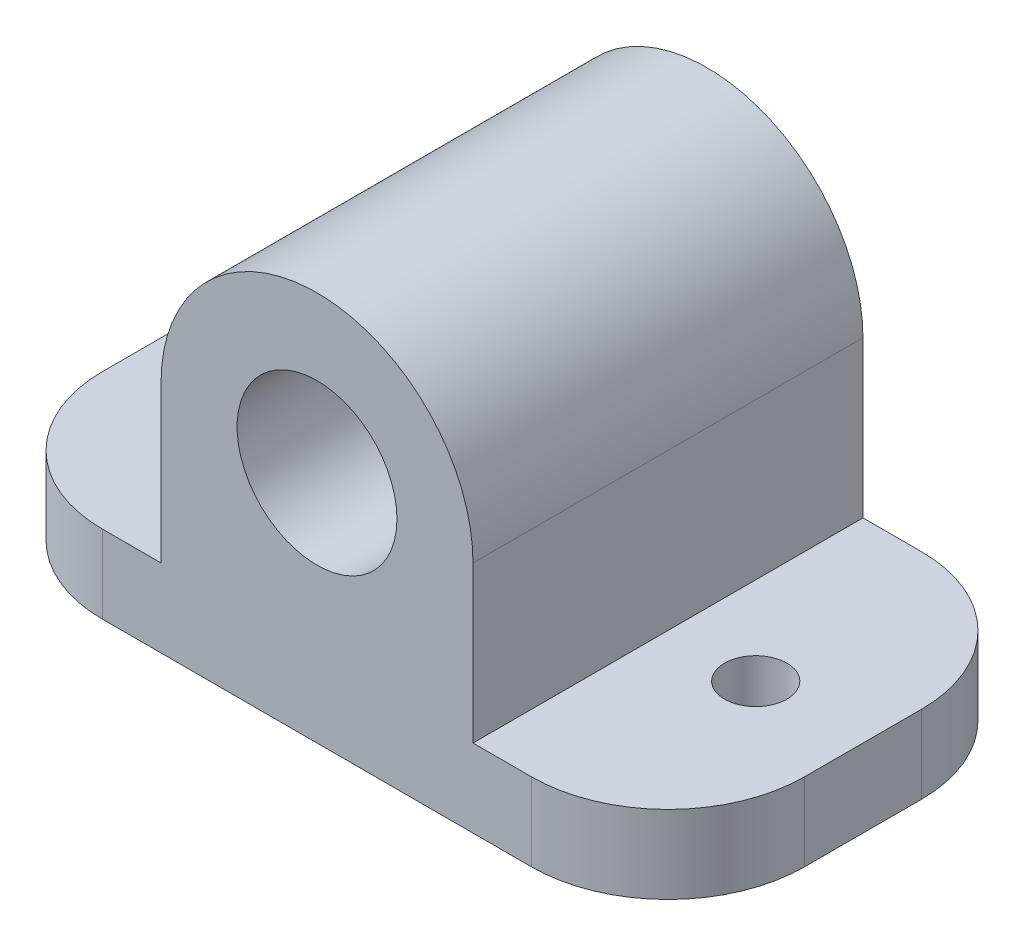
ISO-10303-21;
HEADER;
FILE_DESCRIPTION(('STEP AP214'),'2;1');
FILE_NAME('part.step','',(''),(''),'','','');
FILE_SCHEMA(('AUTOMOTIVE_DESIGN { 1 0 10303 214 1 1 1 1 }'));
ENDSEC;
DATA;
#1=APPLICATION_CONTEXT('core data for automotive mechanical design processes');
#2=APPLICATION_PROTOCOL_DEFINITION('international standard','automotive_design',2000,#1);
#3=PRODUCT_CONTEXT('',#1,'mechanical');
#4=PRODUCT('Part','Part','',(#3));
#5=PRODUCT_RELATED_PRODUCT_CATEGORY('part','',(#4));
#6=PRODUCT_DEFINITION_FORMATION('','',#4);
#7=PRODUCT_DEFINITION_CONTEXT('part definition',#1,'design');
#8=PRODUCT_DEFINITION('design','',#6,#7);
#9=PRODUCT_DEFINITION_SHAPE('','',#8);
#10=(LENGTH_UNIT() NAMED_UNIT(*) SI_UNIT(.MILLI.,.METRE.));
#11=(NAMED_UNIT(*) PLANE_ANGLE_UNIT() SI_UNIT($,.RADIAN.));
#12=(NAMED_UNIT(*) SI_UNIT($,.STERADIAN.) SOLID_ANGLE_UNIT());
#13=UNCERTAINTY_MEASURE_WITH_UNIT(LENGTH_MEASURE(1.E-05),#10,'distance_accuracy_value','');
#14=(GEOMETRIC_REPRESENTATION_CONTEXT(3) GLOBAL_UNCERTAINTY_ASSIGNED_CONTEXT((#13)) GLOBAL_UNIT_ASSIGNED_CONTEXT((#10,
#11,#12)) REPRESENTATION_CONTEXT('',''));
#15=CARTESIAN_POINT('',(0.,0.,0.));
#16=DIRECTION('',(0.,0.,1.));
#17=DIRECTION('',(1.,0.,0.));
#18=AXIS2_PLACEMENT_3D('',#15,#16,#17);
#19=CARTESIAN_POINT('',(0.,0.,20.));
#20=DIRECTION('',(0.,0.,1.));
#21=DIRECTION('',(1.,0.,0.));
#22=AXIS2_PLACEMENT_3D('',#19,#20,#21);
#23=PLANE('',#22);
#24=DIRECTION('',(-1.,0.,0.));
#25=VECTOR('',#24,1.);
#26=CARTESIAN_POINT('',(-8.,-8.,20.));
#27=LINE('',#26,#25);
#28=CARTESIAN_POINT('',(-8.,-8.,20.));
#29=VERTEX_POINT('',#28);
#30=CARTESIAN_POINT('',(-11.,-8.,20.));
#31=VERTEX_POINT('',#30);
#32=EDGE_CURVE('E134',#29,#31,#27,.T.);
#33=ORIENTED_EDGE('',*,*,#32,.T.);
#34=DIRECTION('',(0.,-1.,0.));
#35=VECTOR('',#34,1.);
#36=CARTESIAN_POINT('',(-11.,-12.,20.));
#37=LINE('',#36,#35);
#38=CARTESIAN_POINT('',(-11.,-12.,20.));
#39=VERTEX_POINT('',#38);
#40=EDGE_CURVE('E183',#31,#39,#37,.T.);
#41=ORIENTED_EDGE('',*,*,#40,.T.);
#42=DIRECTION('',(1.,0.,0.));
#43=VECTOR('',#42,1.);
#44=CARTESIAN_POINT('',(-18.,-12.,20.));
#45=LINE('',#44,#43);
#46=CARTESIAN_POINT('',(11.,-12.,20.));
#47=VERTEX_POINT('',#46);
#48=EDGE_CURVE('E240',#39,#47,#45,.T.);
#49=ORIENTED_EDGE('',*,*,#48,.T.);
#50=DIRECTION('',(0.,1.,0.));
#51=VECTOR('',#50,1.);
#52=CARTESIAN_POINT('',(11.,-8.,20.));
#53=LINE('',#52,#51);
#54=CARTESIAN_POINT('',(11.,-8.,20.));
#55=VERTEX_POINT('',#54);
#56=EDGE_CURVE('E180',#47,#55,#53,.T.);
#57=ORIENTED_EDGE('',*,*,#56,.T.);
#58=DIRECTION('',(-1.,0.,0.));
#59=VECTOR('',#58,1.);
#60=CARTESIAN_POINT('',(8.,-8.,20.));
#61=LINE('',#60,#59);
#62=CARTESIAN_POINT('',(8.,-8.,20.));
#63=VERTEX_POINT('',#62);
#64=EDGE_CURVE('E238',#55,#63,#61,.T.);
#65=ORIENTED_EDGE('',*,*,#64,.T.);
#66=DIRECTION('',(0.,1.,0.));
#67=VECTOR('',#66,1.);
#68=CARTESIAN_POINT('',(8.,0.,20.));
#69=LINE('',#68,#67);
#70=CARTESIAN_POINT('',(8.,0.,20.));
#71=VERTEX_POINT('',#70);
#72=EDGE_CURVE('E140',#63,#71,#69,.T.);
#73=ORIENTED_EDGE('',*,*,#72,.T.);
#74=CARTESIAN_POINT('',(0.,0.,20.));
#75=DIRECTION('',(0.,0.,1.));
#76=DIRECTION('',(1.,0.,0.));
#77=AXIS2_PLACEMENT_3D('',#74,#75,#76);
#78=CIRCLE('',#77,8.);
#79=CARTESIAN_POINT('',(-8.,0.,20.));
#80=VERTEX_POINT('',#79);
#81=EDGE_CURVE('E135',#71,#80,#78,.T.);
#82=ORIENTED_EDGE('',*,*,#81,.T.);
#83=DIRECTION('',(0.,-1.,0.));
#84=VECTOR('',#83,1.);
#85=CARTESIAN_POINT('',(-8.,0.,20.));
#86=LINE('',#85,#84);
#87=EDGE_CURVE('E123',#80,#29,#86,.T.);
#88=ORIENTED_EDGE('',*,*,#87,.T.);
#89=EDGE_LOOP('',(#33,#41,#49,#57,#65,#73,#82,#88));
#90=FACE_BOUND('',#89,.T.);
#91=CARTESIAN_POINT('',(0.,0.,20.));
#92=DIRECTION('',(0.,0.,1.));
#93=DIRECTION('',(1.,0.,0.));
#94=AXIS2_PLACEMENT_3D('',#91,#92,#93);
#95=CIRCLE('',#94,4.1);
#96=CARTESIAN_POINT('',(4.1,0.,20.));
#97=VERTEX_POINT('',#96);
#98=EDGE_CURVE('E244',#97,#97,#95,.T.);
#99=ORIENTED_EDGE('',*,*,#98,.F.);
#100=EDGE_LOOP('',(#99));
#101=FACE_BOUND('',#100,.T.);
#102=ADVANCED_FACE('F33',(#90,#101),#23,.T.);
#103=CARTESIAN_POINT('',(0.,0.,0.));
#104=DIRECTION('',(0.,0.,1.));
#105=DIRECTION('',(1.,0.,0.));
#106=AXIS2_PLACEMENT_3D('',#103,#104,#105);
#107=PLANE('',#106);
#108=DIRECTION('',(1.,0.,0.));
#109=VECTOR('',#108,1.);
#110=CARTESIAN_POINT('',(-18.,-12.,0.));
#111=LINE('',#110,#109);
#112=CARTESIAN_POINT('',(-11.,-12.,0.));
#113=VERTEX_POINT('',#112);
#114=CARTESIAN_POINT('',(11.,-12.,0.));
#115=VERTEX_POINT('',#114);
#116=EDGE_CURVE('E224',#113,#115,#111,.T.);
#117=ORIENTED_EDGE('',*,*,#116,.F.);
#118=DIRECTION('',(0.,-1.,0.));
#119=VECTOR('',#118,1.);
#120=CARTESIAN_POINT('',(-11.,0.,0.));
#121=LINE('',#120,#119);
#122=CARTESIAN_POINT('',(-11.,-8.,0.));
#123=VERTEX_POINT('',#122);
#124=EDGE_CURVE('E174',#113,#123,#121,.F.);
#125=ORIENTED_EDGE('',*,*,#124,.T.);
#126=DIRECTION('',(-1.,0.,0.));
#127=VECTOR('',#126,1.);
#128=CARTESIAN_POINT('',(-8.,-8.,0.));
#129=LINE('',#128,#127);
#130=CARTESIAN_POINT('',(-8.,-8.,0.));
#131=VERTEX_POINT('',#130);
#132=EDGE_CURVE('E231',#131,#123,#129,.T.);
#133=ORIENTED_EDGE('',*,*,#132,.F.);
#134=DIRECTION('',(0.,-1.,0.));
#135=VECTOR('',#134,1.);
#136=CARTESIAN_POINT('',(-8.,0.,0.));
#137=LINE('',#136,#135);
#138=CARTESIAN_POINT('',(-8.,0.,0.));
#139=VERTEX_POINT('',#138);
#140=EDGE_CURVE('E234',#139,#131,#137,.T.);
#141=ORIENTED_EDGE('',*,*,#140,.F.);
#142=CARTESIAN_POINT('',(0.,0.,0.));
#143=DIRECTION('',(0.,0.,1.));
#144=DIRECTION('',(1.,0.,0.));
#145=AXIS2_PLACEMENT_3D('',#142,#143,#144);
#146=CIRCLE('',#145,8.);
#147=CARTESIAN_POINT('',(8.,0.,0.));
#148=VERTEX_POINT('',#147);
#149=EDGE_CURVE('E148',#148,#139,#146,.T.);
#150=ORIENTED_EDGE('',*,*,#149,.F.);
#151=DIRECTION('',(0.,1.,0.));
#152=VECTOR('',#151,1.);
#153=CARTESIAN_POINT('',(8.,0.,0.));
#154=LINE('',#153,#152);
#155=CARTESIAN_POINT('',(8.,-8.,0.));
#156=VERTEX_POINT('',#155);
#157=EDGE_CURVE('E144',#156,#148,#154,.T.);
#158=ORIENTED_EDGE('',*,*,#157,.F.);
#159=DIRECTION('',(-1.,0.,0.));
#160=VECTOR('',#159,1.);
#161=CARTESIAN_POINT('',(8.,-8.,0.));
#162=LINE('',#161,#160);
#163=CARTESIAN_POINT('',(11.,-8.,0.));
#164=VERTEX_POINT('',#163);
#165=EDGE_CURVE('E230',#164,#156,#162,.T.);
#166=ORIENTED_EDGE('',*,*,#165,.F.);
#167=DIRECTION('',(0.,1.,0.));
#168=VECTOR('',#167,1.);
#169=CARTESIAN_POINT('',(11.,0.,0.));
#170=LINE('',#169,#168);
#171=EDGE_CURVE('E172',#164,#115,#170,.F.);
#172=ORIENTED_EDGE('',*,*,#171,.T.);
#173=EDGE_LOOP('',(#117,#125,#133,#141,#150,#158,#166,#172));
#174=FACE_BOUND('',#173,.T.);
#175=CARTESIAN_POINT('',(0.,0.,0.));
#176=DIRECTION('',(0.,0.,1.));
#177=DIRECTION('',(1.,0.,0.));
#178=AXIS2_PLACEMENT_3D('',#175,#176,#177);
#179=CIRCLE('',#178,4.1);
#180=CARTESIAN_POINT('',(4.1,0.,0.));
#181=VERTEX_POINT('',#180);
#182=EDGE_CURVE('E159',#181,#181,#179,.T.);
#183=ORIENTED_EDGE('',*,*,#182,.T.);
#184=EDGE_LOOP('',(#183));
#185=FACE_BOUND('',#184,.T.);
#186=ADVANCED_FACE('F226',(#174,#185),#107,.F.);
#187=CARTESIAN_POINT('',(0.,0.,20.));
#188=DIRECTION('',(0.,0.,-1.));
#189=DIRECTION('',(-1.,0.,0.));
#190=AXIS2_PLACEMENT_3D('',#187,#188,#189);
#191=CYLINDRICAL_SURFACE('',#190,8.);
#192=ORIENTED_EDGE('',*,*,#149,.T.);
#193=DIRECTION('',(0.,0.,-1.));
#194=VECTOR('',#193,1.);
#195=CARTESIAN_POINT('',(-8.,0.,20.));
#196=LINE('',#195,#194);
#197=EDGE_CURVE('E127',#80,#139,#196,.T.);
#198=ORIENTED_EDGE('',*,*,#197,.F.);
#199=ORIENTED_EDGE('',*,*,#81,.F.);
#200=DIRECTION('',(0.,0.,-1.));
#201=VECTOR('',#200,1.);
#202=CARTESIAN_POINT('',(8.,0.,20.));
#203=LINE('',#202,#201);
#204=EDGE_CURVE('E202',#71,#148,#203,.T.);
#205=ORIENTED_EDGE('',*,*,#204,.T.);
#206=EDGE_LOOP('',(#192,#198,#199,#205));
#207=FACE_BOUND('',#206,.T.);
#208=ADVANCED_FACE('F146',(#207),#191,.T.);
#209=CARTESIAN_POINT('',(-8.,0.,20.));
#210=DIRECTION('',(1.,0.,0.));
#211=DIRECTION('',(0.,1.,0.));
#212=AXIS2_PLACEMENT_3D('',#209,#210,#211);
#213=PLANE('',#212);
#214=ORIENTED_EDGE('',*,*,#140,.T.);
#215=DIRECTION('',(0.,0.,-1.));
#216=VECTOR('',#215,1.);
#217=CARTESIAN_POINT('',(-8.,-8.,20.));
#218=LINE('',#217,#216);
#219=EDGE_CURVE('E130',#29,#131,#218,.T.);
#220=ORIENTED_EDGE('',*,*,#219,.F.);
#221=ORIENTED_EDGE('',*,*,#87,.F.);
#222=ORIENTED_EDGE('',*,*,#197,.T.);
#223=EDGE_LOOP('',(#214,#220,#221,#222));
#224=FACE_BOUND('',#223,.T.);
#225=ADVANCED_FACE('F125',(#224),#213,.F.);
#226=CARTESIAN_POINT('',(-8.,-8.,20.));
#227=DIRECTION('',(0.,-1.,0.));
#228=DIRECTION('',(1.,0.,0.));
#229=AXIS2_PLACEMENT_3D('',#226,#227,#228);
#230=PLANE('',#229);
#231=CARTESIAN_POINT('',(-12.5,-8.,10.));
#232=DIRECTION('',(0.,1.,0.));
#233=DIRECTION('',(-1.,0.,0.));
#234=AXIS2_PLACEMENT_3D('',#231,#232,#233);
#235=CIRCLE('',#234,1.6);
#236=CARTESIAN_POINT('',(-14.1,-8.,10.));
#237=VERTEX_POINT('',#236);
#238=EDGE_CURVE('E160',#237,#237,#235,.T.);
#239=ORIENTED_EDGE('',*,*,#238,.F.);
#240=EDGE_LOOP('',(#239));
#241=FACE_BOUND('',#240,.T.);
#242=ORIENTED_EDGE('',*,*,#132,.T.);
#243=CARTESIAN_POINT('',(-11.,-8.,7.));
#244=DIRECTION('',(0.,-1.,0.));
#245=DIRECTION('',(1.,0.,0.));
#246=AXIS2_PLACEMENT_3D('',#243,#244,#245);
#247=CIRCLE('',#246,7.);
#248=CARTESIAN_POINT('',(-18.,-8.,7.));
#249=VERTEX_POINT('',#248);
#250=EDGE_CURVE('E178',#123,#249,#247,.F.);
#251=ORIENTED_EDGE('',*,*,#250,.T.);
#252=DIRECTION('',(0.,0.,-1.));
#253=VECTOR('',#252,1.);
#254=CARTESIAN_POINT('',(-18.,-8.,20.));
#255=LINE('',#254,#253);
#256=CARTESIAN_POINT('',(-18.,-8.,13.));
#257=VERTEX_POINT('',#256);
#258=EDGE_CURVE('E153',#257,#249,#255,.T.);
#259=ORIENTED_EDGE('',*,*,#258,.F.);
#260=CARTESIAN_POINT('',(-11.,-8.,13.));
#261=DIRECTION('',(0.,-1.,0.));
#262=DIRECTION('',(1.,0.,0.));
#263=AXIS2_PLACEMENT_3D('',#260,#261,#262);
#264=CIRCLE('',#263,7.);
#265=EDGE_CURVE('E176',#257,#31,#264,.F.);
#266=ORIENTED_EDGE('',*,*,#265,.T.);
#267=ORIENTED_EDGE('',*,*,#32,.F.);
#268=ORIENTED_EDGE('',*,*,#219,.T.);
#269=EDGE_LOOP('',(#242,#251,#259,#266,#267,#268));
#270=FACE_BOUND('',#269,.T.);
#271=ADVANCED_FACE('F245',(#241,#270),#230,.F.);
#272=CARTESIAN_POINT('',(-18.,-8.,20.));
#273=DIRECTION('',(1.,0.,0.));
#274=DIRECTION('',(0.,0.,-1.));
#275=AXIS2_PLACEMENT_3D('',#272,#273,#274);
#276=PLANE('',#275);
#277=ORIENTED_EDGE('',*,*,#258,.T.);
#278=DIRECTION('',(0.,-1.,0.));
#279=VECTOR('',#278,1.);
#280=CARTESIAN_POINT('',(-18.,-8.,7.));
#281=LINE('',#280,#279);
#282=CARTESIAN_POINT('',(-18.,-12.,7.));
#283=VERTEX_POINT('',#282);
#284=EDGE_CURVE('E151',#249,#283,#281,.T.);
#285=ORIENTED_EDGE('',*,*,#284,.T.);
#286=DIRECTION('',(0.,0.,-1.));
#287=VECTOR('',#286,1.);
#288=CARTESIAN_POINT('',(-18.,-12.,20.));
#289=LINE('',#288,#287);
#290=CARTESIAN_POINT('',(-18.,-12.,13.));
#291=VERTEX_POINT('',#290);
#292=EDGE_CURVE('E199',#291,#283,#289,.T.);
#293=ORIENTED_EDGE('',*,*,#292,.F.);
#294=DIRECTION('',(0.,-1.,0.));
#295=VECTOR('',#294,1.);
#296=CARTESIAN_POINT('',(-18.,-8.,13.));
#297=LINE('',#296,#295);
#298=EDGE_CURVE('E149',#291,#257,#297,.F.);
#299=ORIENTED_EDGE('',*,*,#298,.T.);
#300=EDGE_LOOP('',(#277,#285,#293,#299));
#301=FACE_BOUND('',#300,.T.);
#302=ADVANCED_FACE('F211',(#301),#276,.F.);
#303=CARTESIAN_POINT('',(-18.,-12.,20.));
#304=DIRECTION('',(0.,1.,0.));
#305=DIRECTION('',(-1.,0.,0.));
#306=AXIS2_PLACEMENT_3D('',#303,#304,#305);
#307=PLANE('',#306);
#308=CARTESIAN_POINT('',(12.5,-12.,10.));
#309=DIRECTION('',(0.,1.,0.));
#310=DIRECTION('',(-1.,0.,0.));
#311=AXIS2_PLACEMENT_3D('',#308,#309,#310);
#312=CIRCLE('',#311,1.6);
#313=CARTESIAN_POINT('',(10.9,-12.,10.));
#314=VERTEX_POINT('',#313);
#315=EDGE_CURVE('E256',#314,#314,#312,.T.);
#316=ORIENTED_EDGE('',*,*,#315,.T.);
#317=EDGE_LOOP('',(#316));
#318=FACE_BOUND('',#317,.T.);
#319=CARTESIAN_POINT('',(-12.5,-12.,10.));
#320=DIRECTION('',(0.,1.,0.));
#321=DIRECTION('',(-1.,0.,0.));
#322=AXIS2_PLACEMENT_3D('',#319,#320,#321);
#323=CIRCLE('',#322,1.6);
#324=CARTESIAN_POINT('',(-14.1,-12.,10.));
#325=VERTEX_POINT('',#324);
#326=EDGE_CURVE('E157',#325,#325,#323,.T.);
#327=ORIENTED_EDGE('',*,*,#326,.T.);
#328=EDGE_LOOP('',(#327));
#329=FACE_BOUND('',#328,.T.);
#330=ORIENTED_EDGE('',*,*,#292,.T.);
#331=CARTESIAN_POINT('',(-11.,-12.,7.));
#332=DIRECTION('',(0.,1.,0.));
#333=DIRECTION('',(-1.,0.,0.));
#334=AXIS2_PLACEMENT_3D('',#331,#332,#333);
#335=CIRCLE('',#334,7.);
#336=EDGE_CURVE('E170',#283,#113,#335,.F.);
#337=ORIENTED_EDGE('',*,*,#336,.T.);
#338=ORIENTED_EDGE('',*,*,#116,.T.);
#339=CARTESIAN_POINT('',(11.,-12.,7.));
#340=DIRECTION('',(0.,1.,0.));
#341=DIRECTION('',(-1.,0.,0.));
#342=AXIS2_PLACEMENT_3D('',#339,#340,#341);
#343=CIRCLE('',#342,7.);
#344=CARTESIAN_POINT('',(18.,-12.,7.));
#345=VERTEX_POINT('',#344);
#346=EDGE_CURVE('E164',#115,#345,#343,.F.);
#347=ORIENTED_EDGE('',*,*,#346,.T.);
#348=DIRECTION('',(0.,0.,-1.));
#349=VECTOR('',#348,1.);
#350=CARTESIAN_POINT('',(18.,-12.,20.));
#351=LINE('',#350,#349);
#352=CARTESIAN_POINT('',(18.,-12.,13.));
#353=VERTEX_POINT('',#352);
#354=EDGE_CURVE('E193',#353,#345,#351,.T.);
#355=ORIENTED_EDGE('',*,*,#354,.F.);
#356=CARTESIAN_POINT('',(11.,-12.,13.));
#357=DIRECTION('',(0.,1.,0.));
#358=DIRECTION('',(-1.,0.,0.));
#359=AXIS2_PLACEMENT_3D('',#356,#357,#358);
#360=CIRCLE('',#359,7.);
#361=EDGE_CURVE('E166',#353,#47,#360,.F.);
#362=ORIENTED_EDGE('',*,*,#361,.T.);
#363=ORIENTED_EDGE('',*,*,#48,.F.);
#364=CARTESIAN_POINT('',(-11.,-12.,13.));
#365=DIRECTION('',(0.,1.,0.));
#366=DIRECTION('',(-1.,0.,0.));
#367=AXIS2_PLACEMENT_3D('',#364,#365,#366);
#368=CIRCLE('',#367,7.);
#369=EDGE_CURVE('E168',#39,#291,#368,.F.);
#370=ORIENTED_EDGE('',*,*,#369,.T.);
#371=EDGE_LOOP('',(#330,#337,#338,#347,#355,#362,#363,#370));
#372=FACE_BOUND('',#371,.T.);
#373=ADVANCED_FACE('F223',(#318,#329,#372),#307,.F.);
#374=CARTESIAN_POINT('',(18.,-8.,20.));
#375=DIRECTION('',(-1.,0.,0.));
#376=DIRECTION('',(0.,0.,1.));
#377=AXIS2_PLACEMENT_3D('',#374,#375,#376);
#378=PLANE('',#377);
#379=DIRECTION('',(0.,0.,-1.));
#380=VECTOR('',#379,1.);
#381=CARTESIAN_POINT('',(18.,-8.,20.));
#382=LINE('',#381,#380);
#383=CARTESIAN_POINT('',(18.,-8.,13.));
#384=VERTEX_POINT('',#383);
#385=CARTESIAN_POINT('',(18.,-8.,7.));
#386=VERTEX_POINT('',#385);
#387=EDGE_CURVE('E190',#384,#386,#382,.T.);
#388=ORIENTED_EDGE('',*,*,#387,.F.);
#389=DIRECTION('',(0.,1.,0.));
#390=VECTOR('',#389,1.);
#391=CARTESIAN_POINT('',(18.,-12.,13.));
#392=LINE('',#391,#390);
#393=EDGE_CURVE('E11',#384,#353,#392,.F.);
#394=ORIENTED_EDGE('',*,*,#393,.T.);
#395=ORIENTED_EDGE('',*,*,#354,.T.);
#396=DIRECTION('',(0.,1.,0.));
#397=VECTOR('',#396,1.);
#398=CARTESIAN_POINT('',(18.,-8.,7.));
#399=LINE('',#398,#397);
#400=EDGE_CURVE('E41',#345,#386,#399,.T.);
#401=ORIENTED_EDGE('',*,*,#400,.T.);
#402=EDGE_LOOP('',(#388,#394,#395,#401));
#403=FACE_BOUND('',#402,.T.);
#404=ADVANCED_FACE('F189',(#403),#378,.F.);
#405=CARTESIAN_POINT('',(8.,-8.,20.));
#406=DIRECTION('',(0.,-1.,0.));
#407=DIRECTION('',(1.,0.,0.));
#408=AXIS2_PLACEMENT_3D('',#405,#406,#407);
#409=PLANE('',#408);
#410=CARTESIAN_POINT('',(12.5,-7.99999999999999,10.));
#411=DIRECTION('',(0.,1.,0.));
#412=DIRECTION('',(-1.,0.,0.));
#413=AXIS2_PLACEMENT_3D('',#410,#411,#412);
#414=CIRCLE('',#413,1.6);
#415=CARTESIAN_POINT('',(10.9,-7.99999999999999,10.));
#416=VERTEX_POINT('',#415);
#417=EDGE_CURVE('E259',#416,#416,#414,.T.);
#418=ORIENTED_EDGE('',*,*,#417,.F.);
#419=EDGE_LOOP('',(#418));
#420=FACE_BOUND('',#419,.T.);
#421=ORIENTED_EDGE('',*,*,#64,.F.);
#422=CARTESIAN_POINT('',(11.,-8.,13.));
#423=DIRECTION('',(0.,-1.,0.));
#424=DIRECTION('',(1.,0.,0.));
#425=AXIS2_PLACEMENT_3D('',#422,#423,#424);
#426=CIRCLE('',#425,7.);
#427=EDGE_CURVE('E56',#55,#384,#426,.F.);
#428=ORIENTED_EDGE('',*,*,#427,.T.);
#429=ORIENTED_EDGE('',*,*,#387,.T.);
#430=CARTESIAN_POINT('',(11.,-8.,7.));
#431=DIRECTION('',(0.,-1.,0.));
#432=DIRECTION('',(1.,0.,0.));
#433=AXIS2_PLACEMENT_3D('',#430,#431,#432);
#434=CIRCLE('',#433,7.);
#435=EDGE_CURVE('E48',#386,#164,#434,.F.);
#436=ORIENTED_EDGE('',*,*,#435,.T.);
#437=ORIENTED_EDGE('',*,*,#165,.T.);
#438=DIRECTION('',(0.,0.,-1.));
#439=VECTOR('',#438,1.);
#440=CARTESIAN_POINT('',(8.,-8.,20.));
#441=LINE('',#440,#439);
#442=EDGE_CURVE('E197',#63,#156,#441,.T.);
#443=ORIENTED_EDGE('',*,*,#442,.F.);
#444=EDGE_LOOP('',(#421,#428,#429,#436,#437,#443));
#445=FACE_BOUND('',#444,.T.);
#446=ADVANCED_FACE('F195',(#420,#445),#409,.F.);
#447=CARTESIAN_POINT('',(8.,0.,20.));
#448=DIRECTION('',(-1.,0.,0.));
#449=DIRECTION('',(0.,-1.,0.));
#450=AXIS2_PLACEMENT_3D('',#447,#448,#449);
#451=PLANE('',#450);
#452=ORIENTED_EDGE('',*,*,#157,.T.);
#453=ORIENTED_EDGE('',*,*,#204,.F.);
#454=ORIENTED_EDGE('',*,*,#72,.F.);
#455=ORIENTED_EDGE('',*,*,#442,.T.);
#456=EDGE_LOOP('',(#452,#453,#454,#455));
#457=FACE_BOUND('',#456,.T.);
#458=ADVANCED_FACE('F267',(#457),#451,.F.);
#459=CARTESIAN_POINT('',(0.,0.,20.));
#460=DIRECTION('',(0.,0.,-1.));
#461=DIRECTION('',(-1.,0.,0.));
#462=AXIS2_PLACEMENT_3D('',#459,#460,#461);
#463=CYLINDRICAL_SURFACE('',#462,4.1);
#464=ORIENTED_EDGE('',*,*,#98,.T.);
#465=EDGE_LOOP('',(#464));
#466=FACE_BOUND('',#465,.T.);
#467=ORIENTED_EDGE('',*,*,#182,.F.);
#468=EDGE_LOOP('',(#467));
#469=FACE_BOUND('',#468,.T.);
#470=ADVANCED_FACE('F273',(#466,#469),#463,.F.);
#471=CARTESIAN_POINT('',(-12.5,-28.,10.));
#472=DIRECTION('',(0.,1.,0.));
#473=DIRECTION('',(-1.,0.,0.));
#474=AXIS2_PLACEMENT_3D('',#471,#472,#473);
#475=CYLINDRICAL_SURFACE('',#474,1.6);
#476=ORIENTED_EDGE('',*,*,#238,.T.);
#477=EDGE_LOOP('',(#476));
#478=FACE_BOUND('',#477,.T.);
#479=ORIENTED_EDGE('',*,*,#326,.F.);
#480=EDGE_LOOP('',(#479));
#481=FACE_BOUND('',#480,.T.);
#482=ADVANCED_FACE('F286',(#478,#481),#475,.F.);
#483=CARTESIAN_POINT('',(12.5,-28.,10.));
#484=DIRECTION('',(0.,1.,0.));
#485=DIRECTION('',(-1.,0.,0.));
#486=AXIS2_PLACEMENT_3D('',#483,#484,#485);
#487=CYLINDRICAL_SURFACE('',#486,1.6);
#488=ORIENTED_EDGE('',*,*,#417,.T.);
#489=EDGE_LOOP('',(#488));
#490=FACE_BOUND('',#489,.T.);
#491=ORIENTED_EDGE('',*,*,#315,.F.);
#492=EDGE_LOOP('',(#491));
#493=FACE_BOUND('',#492,.T.);
#494=ADVANCED_FACE('F263',(#490,#493),#487,.F.);
#495=CARTESIAN_POINT('',(-11.,-8.,7.));
#496=DIRECTION('',(0.,-1.,0.));
#497=DIRECTION('',(0.,0.,-1.));
#498=AXIS2_PLACEMENT_3D('',#495,#496,#497);
#499=CYLINDRICAL_SURFACE('',#498,7.);
#500=ORIENTED_EDGE('',*,*,#250,.F.);
#501=ORIENTED_EDGE('',*,*,#124,.F.);
#502=ORIENTED_EDGE('',*,*,#336,.F.);
#503=ORIENTED_EDGE('',*,*,#284,.F.);
#504=EDGE_LOOP('',(#500,#501,#502,#503));
#505=FACE_BOUND('',#504,.T.);
#506=ADVANCED_FACE('F218',(#505),#499,.T.);
#507=CARTESIAN_POINT('',(-11.,0.,13.));
#508=DIRECTION('',(0.,1.,0.));
#509=DIRECTION('',(0.,0.,1.));
#510=AXIS2_PLACEMENT_3D('',#507,#508,#509);
#511=CYLINDRICAL_SURFACE('',#510,7.);
#512=ORIENTED_EDGE('',*,*,#265,.F.);
#513=ORIENTED_EDGE('',*,*,#298,.F.);
#514=ORIENTED_EDGE('',*,*,#369,.F.);
#515=ORIENTED_EDGE('',*,*,#40,.F.);
#516=EDGE_LOOP('',(#512,#513,#514,#515));
#517=FACE_BOUND('',#516,.T.);
#518=ADVANCED_FACE('F295',(#517),#511,.T.);
#519=CARTESIAN_POINT('',(11.,0.,13.));
#520=DIRECTION('',(0.,-1.,0.));
#521=DIRECTION('',(0.,0.,-1.));
#522=AXIS2_PLACEMENT_3D('',#519,#520,#521);
#523=CYLINDRICAL_SURFACE('',#522,7.);
#524=ORIENTED_EDGE('',*,*,#361,.F.);
#525=ORIENTED_EDGE('',*,*,#393,.F.);
#526=ORIENTED_EDGE('',*,*,#427,.F.);
#527=ORIENTED_EDGE('',*,*,#56,.F.);
#528=EDGE_LOOP('',(#524,#525,#526,#527));
#529=FACE_BOUND('',#528,.T.);
#530=ADVANCED_FACE('F300',(#529),#523,.T.);
#531=CARTESIAN_POINT('',(11.,-8.,7.));
#532=DIRECTION('',(0.,1.,0.));
#533=DIRECTION('',(0.,0.,1.));
#534=AXIS2_PLACEMENT_3D('',#531,#532,#533);
#535=CYLINDRICAL_SURFACE('',#534,7.);
#536=ORIENTED_EDGE('',*,*,#346,.F.);
#537=ORIENTED_EDGE('',*,*,#171,.F.);
#538=ORIENTED_EDGE('',*,*,#435,.F.);
#539=ORIENTED_EDGE('',*,*,#400,.F.);
#540=EDGE_LOOP('',(#536,#537,#538,#539));
#541=FACE_BOUND('',#540,.T.);
#542=ADVANCED_FACE('F35',(#541),#535,.T.);
#543=CLOSED_SHELL('',(#102,#186,#208,#225,#271,#302,#373,#404,#446,#458,#470,#482,#494,#506,
#518,#530,#542));
#544=MANIFOLD_SOLID_BREP('B2',#543);
#545=ADVANCED_BREP_SHAPE_REPRESENTATION('',(#18,#544),#14);
#546=SHAPE_DEFINITION_REPRESENTATION(#9,#545);
ENDSEC;
END-ISO-10303-21;
